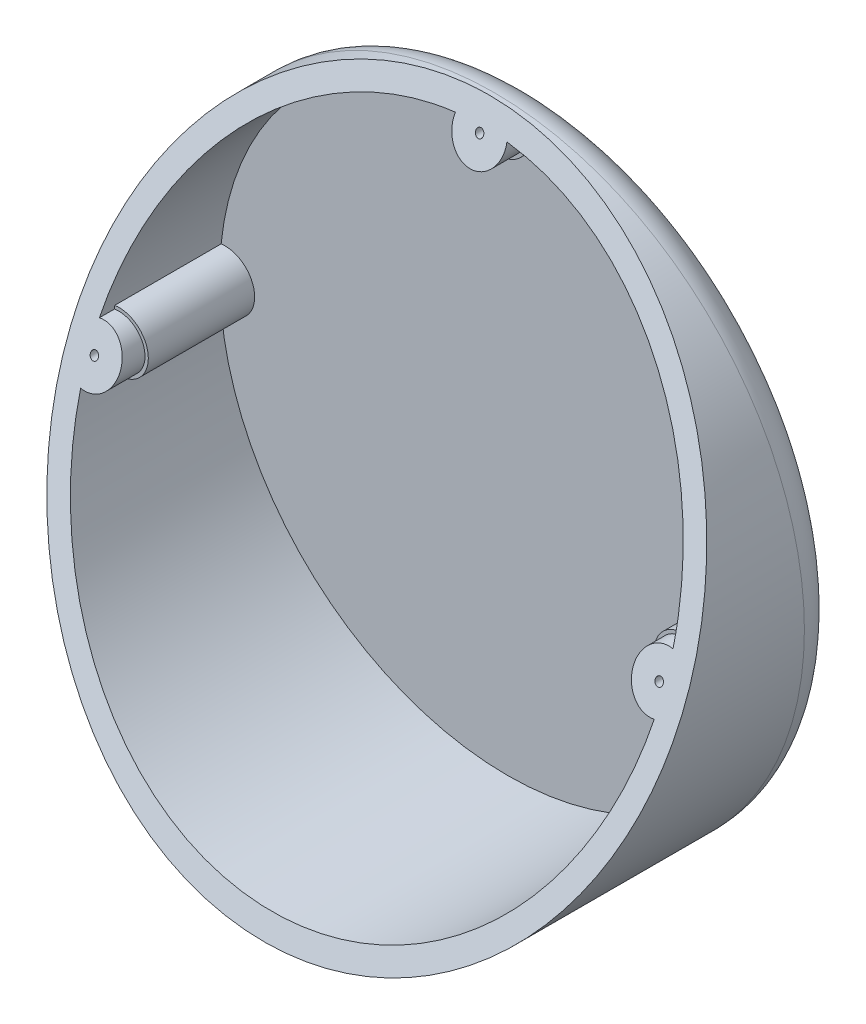
ISO-10303-21;
HEADER;
FILE_DESCRIPTION(('STEP AP214'),'2;1');
FILE_NAME('part.step','',(''),(''),'','','');
FILE_SCHEMA(('AUTOMOTIVE_DESIGN { 1 0 10303 214 1 1 1 1 }'));
ENDSEC;
DATA;
#1=APPLICATION_CONTEXT('core data for automotive mechanical design processes');
#2=APPLICATION_PROTOCOL_DEFINITION('international standard','automotive_design',2000,#1);
#3=PRODUCT_CONTEXT('',#1,'mechanical');
#4=PRODUCT('Part','Part','',(#3));
#5=PRODUCT_RELATED_PRODUCT_CATEGORY('part','',(#4));
#6=PRODUCT_DEFINITION_FORMATION('','',#4);
#7=PRODUCT_DEFINITION_CONTEXT('part definition',#1,'design');
#8=PRODUCT_DEFINITION('design','',#6,#7);
#9=PRODUCT_DEFINITION_SHAPE('','',#8);
#10=(LENGTH_UNIT() NAMED_UNIT(*) SI_UNIT(.MILLI.,.METRE.));
#11=(NAMED_UNIT(*) PLANE_ANGLE_UNIT() SI_UNIT($,.RADIAN.));
#12=(NAMED_UNIT(*) SI_UNIT($,.STERADIAN.) SOLID_ANGLE_UNIT());
#13=UNCERTAINTY_MEASURE_WITH_UNIT(LENGTH_MEASURE(1.E-05),#10,'distance_accuracy_value','');
#14=(GEOMETRIC_REPRESENTATION_CONTEXT(3) GLOBAL_UNCERTAINTY_ASSIGNED_CONTEXT((#13)) GLOBAL_UNIT_ASSIGNED_CONTEXT((#10,
#11,#12)) REPRESENTATION_CONTEXT('',''));
#15=CARTESIAN_POINT('',(0.,0.,0.));
#16=DIRECTION('',(0.,0.,1.));
#17=DIRECTION('',(1.,0.,0.));
#18=AXIS2_PLACEMENT_3D('',#15,#16,#17);
#19=CARTESIAN_POINT('',(0.,0.,60.));
#20=DIRECTION('',(0.,0.,-1.));
#21=DIRECTION('',(-1.,0.,0.));
#22=AXIS2_PLACEMENT_3D('',#19,#20,#21);
#23=CYLINDRICAL_SURFACE('',#22,70.);
#24=CARTESIAN_POINT('',(0.,0.,8.));
#25=DIRECTION('',(0.,0.,1.));
#26=DIRECTION('',(1.,0.,0.));
#27=AXIS2_PLACEMENT_3D('',#24,#25,#26);
#28=CIRCLE('',#27,70.);
#29=CARTESIAN_POINT('',(70.,0.,8.));
#30=VERTEX_POINT('',#29);
#31=EDGE_CURVE('E48',#30,#30,#28,.T.);
#32=ORIENTED_EDGE('',*,*,#31,.T.);
#33=EDGE_LOOP('',(#32));
#34=FACE_BOUND('',#33,.T.);
#35=CARTESIAN_POINT('',(0.,0.,34.5220836013663));
#36=DIRECTION('',(0.,-0.342020143325663,-0.939692620785911));
#37=DIRECTION('',(0.,0.939692620785911,-0.342020143325663));
#38=AXIS2_PLACEMENT_3D('',#35,#36,#37);
#39=ELLIPSE('',#38,74.4924440733137,70.);
#40=CARTESIAN_POINT('',(0.,70.,9.04416720273264));
#41=VERTEX_POINT('',#40);
#42=EDGE_CURVE('E248',#41,#41,#39,.T.);
#43=ORIENTED_EDGE('',*,*,#42,.T.);
#44=EDGE_LOOP('',(#43));
#45=FACE_BOUND('',#44,.T.);
#46=ADVANCED_FACE('F35',(#34,#45),#23,.T.);
#47=CARTESIAN_POINT('',(0.,0.,0.));
#48=DIRECTION('',(0.,0.,1.));
#49=DIRECTION('',(1.,0.,0.));
#50=AXIS2_PLACEMENT_3D('',#47,#48,#49);
#51=PLANE('',#50);
#52=CARTESIAN_POINT('',(0.,0.,0.));
#53=DIRECTION('',(0.,0.,1.));
#54=DIRECTION('',(1.,0.,0.));
#55=AXIS2_PLACEMENT_3D('',#52,#53,#54);
#56=CIRCLE('',#55,62.);
#57=CARTESIAN_POINT('',(62.,0.,0.));
#58=VERTEX_POINT('',#57);
#59=EDGE_CURVE('E11',#58,#58,#56,.F.);
#60=ORIENTED_EDGE('',*,*,#59,.T.);
#61=EDGE_LOOP('',(#60));
#62=FACE_BOUND('',#61,.T.);
#63=ADVANCED_FACE('F309',(#62),#51,.F.);
#64=CARTESIAN_POINT('',(-70.,70.,9.04416720273264));
#65=DIRECTION('',(0.,-0.342020143325663,-0.939692620785911));
#66=DIRECTION('',(0.,0.939692620785911,-0.342020143325663));
#67=AXIS2_PLACEMENT_3D('',#64,#65,#66);
#68=PLANE('',#67);
#69=CARTESIAN_POINT('',(0.,63.75,11.3189811668964));
#70=DIRECTION('',(0.,-0.342020143325663,-0.939692620785911));
#71=DIRECTION('',(0.,0.939692620785911,-0.342020143325663));
#72=AXIS2_PLACEMENT_3D('',#69,#70,#71);
#73=ELLIPSE('',#72,6.27864885760786,5.89999999999999);
#74=CARTESIAN_POINT('',(5.81647776002555,64.7392352941177,10.958928965152));
#75=VERTEX_POINT('',#74);
#76=CARTESIAN_POINT('',(-5.81647776002555,64.7392352941177,10.958928965152));
#77=VERTEX_POINT('',#76);
#78=EDGE_CURVE('E176',#75,#77,#73,.T.);
#79=ORIENTED_EDGE('',*,*,#78,.F.);
#80=CARTESIAN_POINT('',(0.,0.,34.5220836013663));
#81=DIRECTION('',(0.,-0.342020143325663,-0.939692620785911));
#82=DIRECTION('',(0.,0.939692620785911,-0.342020143325663));
#83=AXIS2_PLACEMENT_3D('',#80,#81,#82);
#84=ELLIPSE('',#83,69.1715552109342,65.);
#85=CARTESIAN_POINT('',(64.7392352941177,5.81647776002555,32.4050588284457));
#86=VERTEX_POINT('',#85);
#87=EDGE_CURVE('E152',#75,#86,#84,.T.);
#88=ORIENTED_EDGE('',*,*,#87,.T.);
#89=CARTESIAN_POINT('',(63.75,0.,34.5220836013663));
#90=DIRECTION('',(0.,-0.342020143325663,-0.939692620785911));
#91=DIRECTION('',(0.,0.939692620785911,-0.342020143325663));
#92=AXIS2_PLACEMENT_3D('',#89,#90,#91);
#93=ELLIPSE('',#92,6.27864885760786,5.89999999999999);
#94=CARTESIAN_POINT('',(64.7392352941177,-5.81647776002555,36.6391083742869));
#95=VERTEX_POINT('',#94);
#96=EDGE_CURVE('E166',#95,#86,#93,.T.);
#97=ORIENTED_EDGE('',*,*,#96,.F.);
#98=CARTESIAN_POINT('',(-64.7392352941177,-5.81647776002555,36.6391083742869));
#99=VERTEX_POINT('',#98);
#100=EDGE_CURVE('E56',#95,#99,#84,.T.);
#101=ORIENTED_EDGE('',*,*,#100,.T.);
#102=CARTESIAN_POINT('',(-63.75,0.,34.5220836013663));
#103=DIRECTION('',(0.,-0.342020143325663,-0.939692620785911));
#104=DIRECTION('',(0.,0.939692620785911,-0.342020143325663));
#105=AXIS2_PLACEMENT_3D('',#102,#103,#104);
#106=ELLIPSE('',#105,6.27864885760786,5.89999999999999);
#107=CARTESIAN_POINT('',(-64.7392352941177,5.81647776002555,32.4050588284457));
#108=VERTEX_POINT('',#107);
#109=EDGE_CURVE('E170',#108,#99,#106,.T.);
#110=ORIENTED_EDGE('',*,*,#109,.F.);
#111=EDGE_CURVE('E183',#108,#77,#84,.T.);
#112=ORIENTED_EDGE('',*,*,#111,.T.);
#113=EDGE_LOOP('',(#79,#88,#97,#101,#110,#112));
#114=FACE_BOUND('',#113,.T.);
#115=CARTESIAN_POINT('',(63.75,0.,34.5220836013663));
#116=DIRECTION('',(0.,-0.342020143325663,-0.939692620785911));
#117=DIRECTION('',(0.,0.939692620785911,-0.342020143325663));
#118=AXIS2_PLACEMENT_3D('',#115,#116,#117);
#119=ELLIPSE('',#118,0.957759995228309,0.899999999999991);
#120=CARTESIAN_POINT('',(63.75,0.899999999999991,34.1945103905268));
#121=VERTEX_POINT('',#120);
#122=EDGE_CURVE('E232',#121,#121,#119,.T.);
#123=ORIENTED_EDGE('',*,*,#122,.T.);
#124=EDGE_LOOP('',(#123));
#125=FACE_BOUND('',#124,.T.);
#126=CARTESIAN_POINT('',(-63.75,0.,34.5220836013663));
#127=DIRECTION('',(0.,-0.342020143325663,-0.939692620785911));
#128=DIRECTION('',(0.,0.939692620785911,-0.342020143325663));
#129=AXIS2_PLACEMENT_3D('',#126,#127,#128);
#130=ELLIPSE('',#129,0.957759995228309,0.899999999999991);
#131=CARTESIAN_POINT('',(-63.75,0.899999999999991,34.1945103905268));
#132=VERTEX_POINT('',#131);
#133=EDGE_CURVE('E240',#132,#132,#130,.T.);
#134=ORIENTED_EDGE('',*,*,#133,.T.);
#135=EDGE_LOOP('',(#134));
#136=FACE_BOUND('',#135,.T.);
#137=CARTESIAN_POINT('',(0.,63.75,11.3189811668964));
#138=DIRECTION('',(0.,-0.342020143325663,-0.939692620785911));
#139=DIRECTION('',(0.,0.939692620785911,-0.342020143325663));
#140=AXIS2_PLACEMENT_3D('',#137,#138,#139);
#141=ELLIPSE('',#140,0.95775999522831,0.899999999999992);
#142=CARTESIAN_POINT('',(0.,64.65,10.9914079560568));
#143=VERTEX_POINT('',#142);
#144=EDGE_CURVE('E247',#143,#143,#141,.T.);
#145=ORIENTED_EDGE('',*,*,#144,.T.);
#146=EDGE_LOOP('',(#145));
#147=FACE_BOUND('',#146,.T.);
#148=ORIENTED_EDGE('',*,*,#42,.F.);
#149=EDGE_LOOP('',(#148));
#150=FACE_BOUND('',#149,.T.);
#151=ADVANCED_FACE('F305',(#114,#125,#136,#147,#150),#68,.F.);
#152=CARTESIAN_POINT('',(0.,63.75,0.));
#153=DIRECTION('',(0.,0.,-1.));
#154=DIRECTION('',(-1.,0.,0.));
#155=AXIS2_PLACEMENT_3D('',#152,#153,#154);
#156=CYLINDRICAL_SURFACE('',#155,0.899999999999992);
#157=CARTESIAN_POINT('',(0.,63.75,1.8));
#158=DIRECTION('',(0.,0.,-1.));
#159=DIRECTION('',(-1.,0.,0.));
#160=AXIS2_PLACEMENT_3D('',#157,#158,#159);
#161=CIRCLE('',#160,0.9);
#162=CARTESIAN_POINT('',(-0.9,63.75,1.8));
#163=VERTEX_POINT('',#162);
#164=EDGE_CURVE('E244',#163,#163,#161,.T.);
#165=ORIENTED_EDGE('',*,*,#164,.T.);
#166=EDGE_LOOP('',(#165));
#167=FACE_BOUND('',#166,.T.);
#168=ORIENTED_EDGE('',*,*,#144,.F.);
#169=EDGE_LOOP('',(#168));
#170=FACE_BOUND('',#169,.T.);
#171=ADVANCED_FACE('F301',(#167,#170),#156,.F.);
#172=CARTESIAN_POINT('',(0.9,63.75,1.8));
#173=DIRECTION('',(0.,0.,1.));
#174=DIRECTION('',(1.,0.,0.));
#175=AXIS2_PLACEMENT_3D('',#172,#173,#174);
#176=PLANE('',#175);
#177=ORIENTED_EDGE('',*,*,#164,.F.);
#178=EDGE_LOOP('',(#177));
#179=FACE_BOUND('',#178,.T.);
#180=CARTESIAN_POINT('',(0.,63.75,1.8));
#181=DIRECTION('',(0.,0.,-1.));
#182=DIRECTION('',(-1.,0.,0.));
#183=AXIS2_PLACEMENT_3D('',#180,#181,#182);
#184=CIRCLE('',#183,1.65);
#185=CARTESIAN_POINT('',(-1.65,63.75,1.8));
#186=VERTEX_POINT('',#185);
#187=EDGE_CURVE('E241',#186,#186,#184,.T.);
#188=ORIENTED_EDGE('',*,*,#187,.T.);
#189=EDGE_LOOP('',(#188));
#190=FACE_BOUND('',#189,.T.);
#191=ADVANCED_FACE('F297',(#179,#190),#176,.F.);
#192=CARTESIAN_POINT('',(0.,63.75,0.));
#193=DIRECTION('',(0.,0.,-1.));
#194=DIRECTION('',(-1.,0.,0.));
#195=AXIS2_PLACEMENT_3D('',#192,#193,#194);
#196=CYLINDRICAL_SURFACE('',#195,1.65);
#197=ORIENTED_EDGE('',*,*,#187,.F.);
#198=EDGE_LOOP('',(#197));
#199=FACE_BOUND('',#198,.T.);
#200=CARTESIAN_POINT('',(1.64946823462954,63.7081127352517,0.189176745255946));
#201=CARTESIAN_POINT('',(1.64716596129973,63.6175369460716,0.169116172164208));
#202=CARTESIAN_POINT('',(1.63737753041773,63.5267726492758,0.150637859461782));
#203=CARTESIAN_POINT('',(1.60274681175292,63.3474524319575,0.117250854261556));
#204=CARTESIAN_POINT('',(1.57790005137276,63.2588971756998,0.10234322415751));
#205=CARTESIAN_POINT('',(1.51356731613335,63.0866204653902,0.0761612330118179));
#206=CARTESIAN_POINT('',(1.47407118651285,63.0029024110628,0.0648894024186882));
#207=CARTESIAN_POINT('',(1.38142703252199,62.8429724663497,0.0457395207333062));
#208=CARTESIAN_POINT('',(1.32827983994076,62.7667601190163,0.0378612629415091));
#209=CARTESIAN_POINT('',(1.21057127173455,62.6251041196398,0.0250589350929556));
#210=CARTESIAN_POINT('',(1.14616379665402,62.5595357426765,0.0200985380832089));
#211=CARTESIAN_POINT('',(1.00729197057499,62.4399386608513,0.0123208684116141));
#212=CARTESIAN_POINT('',(0.932827386242477,62.3859102238015,0.00950364548340374));
#213=CARTESIAN_POINT('',(0.775658448924592,62.2907803247682,0.00531224276211168));
#214=CARTESIAN_POINT('',(0.692925896679848,62.249725238595,0.00394319974907593));
#215=CARTESIAN_POINT('',(0.521769749214476,62.1819666791094,0.002042665088863));
#216=CARTESIAN_POINT('',(0.433345998768424,62.1552635974287,0.00151119629631156));
#217=CARTESIAN_POINT('',(0.252715340161557,62.1168392279502,0.00083503922353695));
#218=CARTESIAN_POINT('',(0.160488113472051,62.1052133518631,0.000692807895673315));
#219=CARTESIAN_POINT('',(-0.0246108342454278,62.0975852037299,0.000593412313948232));
#220=CARTESIAN_POINT('',(-0.117482564535827,62.1015831566863,0.00063625072532229));
#221=CARTESIAN_POINT('',(-0.301376930076902,62.1251070899242,0.000979741014404603));
#222=CARTESIAN_POINT('',(-0.392396655736193,62.1446558200126,0.00128077066010881));
#223=CARTESIAN_POINT('',(-0.569861141752124,62.1987542587002,0.00248534587152603));
#224=CARTESIAN_POINT('',(-0.656305847537114,62.2333041461907,0.00338889862249395));
#225=CARTESIAN_POINT('',(-0.822108987922822,62.3163925512165,0.00636062390383876));
#226=CARTESIAN_POINT('',(-0.901471333728862,62.3649232844833,0.00842814896618565));
#227=CARTESIAN_POINT('',(-1.05088670916843,62.4745696073834,0.0144197850229914));
#228=CARTESIAN_POINT('',(-1.12094014724031,62.5356846445667,0.0183438145268432));
#229=CARTESIAN_POINT('',(-1.24941432604106,62.6683580662472,0.028733225716578));
#230=CARTESIAN_POINT('',(-1.30788963530667,62.7398645666319,0.0351862371546038));
#231=CARTESIAN_POINT('',(-1.41198516084893,62.8913708432076,0.0512295859747638));
#232=CARTESIAN_POINT('',(-1.45760642704571,62.9713699249881,0.0608196669822341));
#233=CARTESIAN_POINT('',(-1.53455497248888,63.1368792024291,0.0834440644889267));
#234=CARTESIAN_POINT('',(-1.56597184471156,63.2223508596807,0.0964559502469035));
#235=CARTESIAN_POINT('',(-1.61427071050211,63.3967080013262,0.126035796335046));
#236=CARTESIAN_POINT('',(-1.63115225350114,63.4855935914566,0.142603866880602));
#237=CARTESIAN_POINT('',(-1.6503154768705,63.6651637710713,0.179253627970161));
#238=CARTESIAN_POINT('',(-1.65244467381088,63.7558574596646,0.199369817699489));
#239=CARTESIAN_POINT('',(-1.64199088702002,63.9357002017467,0.242452907213676));
#240=CARTESIAN_POINT('',(-1.62940515890555,64.0248489639542,0.265420338050477));
#241=CARTESIAN_POINT('',(-1.58940604412198,64.2026574200259,0.314299447106258));
#242=CARTESIAN_POINT('',(-1.56145801536247,64.2911753119463,0.340288909839039));
#243=CARTESIAN_POINT('',(-1.49132041502406,64.4620381009263,0.393354204577875));
#244=CARTESIAN_POINT('',(-1.44912675817281,64.5443812189351,0.420430346250138));
#245=CARTESIAN_POINT('',(-1.34959375238493,64.7040973040246,0.475446693065493));
#246=CARTESIAN_POINT('',(-1.29171356333333,64.7811372336628,0.503377858444082));
#247=CARTESIAN_POINT('',(-1.16303128968121,64.9243621897449,0.557355149166511));
#248=CARTESIAN_POINT('',(-1.09222759737388,64.9905458637041,0.583401039415145));
#249=CARTESIAN_POINT('',(-0.939772282192255,65.1096419860012,0.631678770574291));
#250=CARTESIAN_POINT('',(-0.85818761730344,65.16263095486,0.653932354861402));
#251=CARTESIAN_POINT('',(-0.685948030303785,65.2538129618004,0.693018181626965));
#252=CARTESIAN_POINT('',(-0.595298595203784,65.2920148832486,0.709853678011147));
#253=CARTESIAN_POINT('',(-0.414395580702783,65.3497308985496,0.735580878689558));
#254=CARTESIAN_POINT('',(-0.324574006596908,65.3703825894645,0.74495312167956));
#255=CARTESIAN_POINT('',(-0.142314441176538,65.3964224536751,0.756803234561929));
#256=CARTESIAN_POINT('',(-0.0498778951207296,65.4018188980786,0.759284840415262));
#257=CARTESIAN_POINT('',(0.127738259586101,65.397269145666,0.757204178654208));
#258=CARTESIAN_POINT('',(0.212954417330315,65.3884156319342,0.75314354483476));
#259=CARTESIAN_POINT('',(0.38053156460961,65.357778199205,0.739248344423713));
#260=CARTESIAN_POINT('',(0.462892519525226,65.3359941234819,0.729413707847977));
#261=CARTESIAN_POINT('',(0.622763805551098,65.2803098390793,0.704708405404111));
#262=CARTESIAN_POINT('',(0.700264310489702,65.2463859605323,0.689827904234969));
#263=CARTESIAN_POINT('',(0.848521036556983,65.1675913817721,0.65606549064265));
#264=CARTESIAN_POINT('',(0.919275538886677,65.1227179020449,0.637182562378971));
#265=CARTESIAN_POINT('',(1.05740698870701,65.0197734816315,0.595110010869527));
#266=CARTESIAN_POINT('',(1.12419117560922,64.9609936256059,0.571710253521818));
#267=CARTESIAN_POINT('',(1.24718584248185,64.8339074712973,0.523001891452199));
#268=CARTESIAN_POINT('',(1.30339082163832,64.7655962490074,0.497692303214266));
#269=CARTESIAN_POINT('',(1.40785275996063,64.6156800492658,0.444572678372471));
#270=CARTESIAN_POINT('',(1.4552131015191,64.5334652721266,0.416716256427111));
#271=CARTESIAN_POINT('',(1.53523570536906,64.3619615228988,0.361785995942404));
#272=CARTESIAN_POINT('',(1.56790510849215,64.2726760125608,0.334711783195855));
#273=CARTESIAN_POINT('',(1.6134065048059,64.1045375943675,0.286937782731519));
#274=CARTESIAN_POINT('',(1.62863141169014,64.0264135288501,0.265925938679276));
#275=CARTESIAN_POINT('',(1.6476801357291,63.8682795732464,0.225922118171494));
#276=CARTESIAN_POINT('',(1.65150568712938,63.7882699718837,0.206929834893264));
#277=CARTESIAN_POINT('',(1.64946823462954,63.7081127352517,0.189176745255946));
#278=B_SPLINE_CURVE_WITH_KNOTS('',3,(#200,#201,#202,#203,#204,#205,#206,#207,#208,#209,#210,
#211,#212,#213,#214,#215,#216,#217,#218,#219,#220,#221,#222,#223,#224,#225,#226,#227,#228,#229,
#230,#231,#232,#233,#234,#235,#236,#237,#238,#239,#240,#241,#242,#243,#244,#245,#246,#247,#248,
#249,#250,#251,#252,#253,#254,#255,#256,#257,#258,#259,#260,#261,#262,#263,#264,#265,#266,#267,
#268,#269,#270,#271,#272,#273,#274,#275,#276,#277),.UNSPECIFIED.,.T.,.F.,(4,2,2,2,2,2,2,2,2,2,2,
2,2,2,2,2,2,2,2,2,2,2,2,2,2,2,2,2,2,2,2,2,2,2,2,2,2,2,4),(0.,0.278116512202585,0.55631567057248,
0.834708034660553,1.11308343971521,1.38791544556012,1.66275382885175,1.93856384433904,
2.21438138563765,2.49193597540215,2.76949456231289,3.04745994834735,3.3254286492553,
3.60324288061932,3.88104491855698,4.15750474467914,4.43394198297104,4.70861042404362,
4.98328737903307,5.26079927440547,5.538362934941,5.82626135160027,6.11424240019736,
6.41380445081456,6.71340379291451,7.01122292366064,7.30886285988667,7.58529541605821,
7.86157806692169,8.11766497795304,8.37375499296483,8.63034707068835,8.88700435120138,
9.16181308875075,9.43676432476543,9.73207354034854,10.0272390592695,10.2734024494348,
10.519528387521),.UNSPECIFIED.);
#279=CARTESIAN_POINT('',(1.64946823462954,63.7081127352517,0.189176745255946));
#280=VERTEX_POINT('',#279);
#281=EDGE_CURVE('E40',#280,#280,#278,.T.);
#282=ORIENTED_EDGE('',*,*,#281,.T.);
#283=EDGE_LOOP('',(#282));
#284=FACE_BOUND('',#283,.T.);
#285=ADVANCED_FACE('F292',(#199,#284),#196,.F.);
#286=CARTESIAN_POINT('',(-63.75,0.,0.));
#287=DIRECTION('',(0.,0.,-1.));
#288=DIRECTION('',(-1.,0.,0.));
#289=AXIS2_PLACEMENT_3D('',#286,#287,#288);
#290=CYLINDRICAL_SURFACE('',#289,0.899999999999991);
#291=CARTESIAN_POINT('',(-63.75,0.,24.));
#292=DIRECTION('',(0.,0.,-1.));
#293=DIRECTION('',(-1.,0.,0.));
#294=AXIS2_PLACEMENT_3D('',#291,#292,#293);
#295=CIRCLE('',#294,0.899999999999998);
#296=CARTESIAN_POINT('',(-64.65,0.,24.));
#297=VERTEX_POINT('',#296);
#298=EDGE_CURVE('E236',#297,#297,#295,.T.);
#299=ORIENTED_EDGE('',*,*,#298,.T.);
#300=EDGE_LOOP('',(#299));
#301=FACE_BOUND('',#300,.T.);
#302=ORIENTED_EDGE('',*,*,#133,.F.);
#303=EDGE_LOOP('',(#302));
#304=FACE_BOUND('',#303,.T.);
#305=ADVANCED_FACE('F289',(#301,#304),#290,.F.);
#306=CARTESIAN_POINT('',(-62.85,0.,24.));
#307=DIRECTION('',(0.,0.,1.));
#308=DIRECTION('',(1.,0.,0.));
#309=AXIS2_PLACEMENT_3D('',#306,#307,#308);
#310=PLANE('',#309);
#311=ORIENTED_EDGE('',*,*,#298,.F.);
#312=EDGE_LOOP('',(#311));
#313=FACE_BOUND('',#312,.T.);
#314=CARTESIAN_POINT('',(-63.75,0.,24.));
#315=DIRECTION('',(0.,0.,-1.));
#316=DIRECTION('',(-1.,0.,0.));
#317=AXIS2_PLACEMENT_3D('',#314,#315,#316);
#318=CIRCLE('',#317,1.64999999999999);
#319=CARTESIAN_POINT('',(-65.4,0.,24.));
#320=VERTEX_POINT('',#319);
#321=EDGE_CURVE('E233',#320,#320,#318,.T.);
#322=ORIENTED_EDGE('',*,*,#321,.T.);
#323=EDGE_LOOP('',(#322));
#324=FACE_BOUND('',#323,.T.);
#325=ADVANCED_FACE('F285',(#313,#324),#310,.F.);
#326=CARTESIAN_POINT('',(-63.75,0.,0.));
#327=DIRECTION('',(0.,0.,-1.));
#328=DIRECTION('',(-1.,0.,0.));
#329=AXIS2_PLACEMENT_3D('',#326,#327,#328);
#330=CYLINDRICAL_SURFACE('',#329,1.65);
#331=ORIENTED_EDGE('',*,*,#321,.F.);
#332=EDGE_LOOP('',(#331));
#333=FACE_BOUND('',#332,.T.);
#334=CARTESIAN_POINT('',(-62.1,0.,0.000625024415970018));
#335=CARTESIAN_POINT('',(-62.1000032094629,-0.092643698952836,0.000623851075779382));
#336=CARTESIAN_POINT('',(-62.1078261692389,-0.185330370051784,0.000713050028932986));
#337=CARTESIAN_POINT('',(-62.138916340628,-0.368127594195056,0.0012086796301893));
#338=CARTESIAN_POINT('',(-62.16219566222,-0.458236069447161,0.00161535906655138));
#339=CARTESIAN_POINT('',(-62.2235376576828,-0.633250552957479,0.00315121137418916));
#340=CARTESIAN_POINT('',(-62.2615970587068,-0.718157708161321,0.00428022433038405));
#341=CARTESIAN_POINT('',(-62.3514016474966,-0.880348947984115,0.00786318712231402));
#342=CARTESIAN_POINT('',(-62.4031445218336,-0.957634318168672,0.0103169130652715));
#343=CARTESIAN_POINT('',(-62.5186776491833,-1.10221983406808,0.0172490895046733));
#344=CARTESIAN_POINT('',(-62.5824406870088,-1.16954193490411,0.0217229973737438));
#345=CARTESIAN_POINT('',(-62.7201845211141,-1.29247837861104,0.0333852209097131));
#346=CARTESIAN_POINT('',(-62.7941647285993,-1.34809339567157,0.0405733802011747));
#347=CARTESIAN_POINT('',(-62.9495133057976,-1.44570931727351,0.0581561760095479));
#348=CARTESIAN_POINT('',(-63.0308238836301,-1.48780651394155,0.0685270550777448));
#349=CARTESIAN_POINT('',(-63.1988167784365,-1.55787684987884,0.092801031781793));
#350=CARTESIAN_POINT('',(-63.2854989457032,-1.58585038257862,0.106704031010249));
#351=CARTESIAN_POINT('',(-63.4617957816336,-1.62715985652019,0.138075075788033));
#352=CARTESIAN_POINT('',(-63.5514148142731,-1.64047289380819,0.155548649270587));
#353=CARTESIAN_POINT('',(-63.7309304959672,-1.65234147043629,0.193737825528753));
#354=CARTESIAN_POINT('',(-63.8208271800781,-1.65089506315085,0.214453855597701));
#355=CARTESIAN_POINT('',(-64.0010254753856,-1.63337305238348,0.259142499310053));
#356=CARTESIAN_POINT('',(-64.0912689483324,-1.61689213024705,0.283189598880067));
#357=CARTESIAN_POINT('',(-64.2673220959964,-1.56945710072082,0.333169067108692));
#358=CARTESIAN_POINT('',(-64.3531306248704,-1.53849927353076,0.359101918858933));
#359=CARTESIAN_POINT('',(-64.5219655264909,-1.46135515634642,0.412902156259354));
#360=CARTESIAN_POINT('',(-64.6047013511874,-1.41455632372484,0.440804386998846));
#361=CARTESIAN_POINT('',(-64.7610981772551,-1.30735332234228,0.495991778004494));
#362=CARTESIAN_POINT('',(-64.8347568328016,-1.24694564798994,0.523276777277545));
#363=CARTESIAN_POINT('',(-64.9721757517149,-1.11272903968891,0.576051823212608));
#364=CARTESIAN_POINT('',(-65.0357447401824,-1.03870817562729,0.601503093655006));
#365=CARTESIAN_POINT('',(-65.1493239531966,-0.879730282523726,0.648246754552388));
#366=CARTESIAN_POINT('',(-65.1993385377794,-0.794776783174568,0.669540481743898));
#367=CARTESIAN_POINT('',(-65.2816955549597,-0.620659440382631,0.705254099885658));
#368=CARTESIAN_POINT('',(-65.3147899380272,-0.531911895672553,0.71996196856372));
#369=CARTESIAN_POINT('',(-65.3653851882667,-0.349272641186529,0.742653154007391));
#370=CARTESIAN_POINT('',(-65.3828971453623,-0.255384640441945,0.75064125297321));
#371=CARTESIAN_POINT('',(-65.4006703935162,-0.0736236976295547,0.758754845384123));
#372=CARTESIAN_POINT('',(-65.4022523401615,0.014095321572717,0.759482229854129));
#373=CARTESIAN_POINT('',(-65.3915235874724,0.188488339626496,0.754577107284764));
#374=CARTESIAN_POINT('',(-65.3792151358374,0.27516250525934,0.748945629215884));
#375=CARTESIAN_POINT('',(-65.3418555076124,0.442270958120942,0.732075653091026));
#376=CARTESIAN_POINT('',(-65.3172107943123,0.522815362650291,0.721016212686436));
#377=CARTESIAN_POINT('',(-65.2563391819298,0.678554915435853,0.694205722978661));
#378=CARTESIAN_POINT('',(-65.2201100699012,0.753749038279714,0.678453777314199));
#379=CARTESIAN_POINT('',(-65.1351191612585,0.900845729197236,0.642394652604396));
#380=CARTESIAN_POINT('',(-65.0858138683584,0.972386629383774,0.621896607583269));
#381=CARTESIAN_POINT('',(-64.9771295127609,1.10639215397026,0.578136699106842));
#382=CARTESIAN_POINT('',(-64.9177466821609,1.16885336727837,0.554873802876441));
#383=CARTESIAN_POINT('',(-64.7851655657224,1.28822328258956,0.504883484745199));
#384=CARTESIAN_POINT('',(-64.7112367974792,1.34426851601681,0.478028141304098));
#385=CARTESIAN_POINT('',(-64.555124111281,1.44319792192037,0.424024149846507));
#386=CARTESIAN_POINT('',(-64.4729377627586,1.48607820422376,0.396875417583738));
#387=CARTESIAN_POINT('',(-64.2985471375919,1.55913800979868,0.342453429163668));
#388=CARTESIAN_POINT('',(-64.2060631808677,1.58868722746522,0.315225677522081));
#389=CARTESIAN_POINT('',(-64.0166947236092,1.63119180951457,0.263188837038907));
#390=CARTESIAN_POINT('',(-63.9198106801038,1.64414889322895,0.238379497839641));
#391=CARTESIAN_POINT('',(-63.7263507939029,1.65261323089869,0.192635568019692));
#392=CARTESIAN_POINT('',(-63.6298054811815,1.64845435981362,0.171635105896064));
#393=CARTESIAN_POINT('',(-63.438181136528,1.62314531653397,0.133547250690377));
#394=CARTESIAN_POINT('',(-63.3431016903054,1.60200003829464,0.116458732359763));
#395=CARTESIAN_POINT('',(-63.1617155359391,1.54436767998062,0.0870735385121131));
#396=CARTESIAN_POINT('',(-63.0752066884157,1.50860711274053,0.0745970993201759));
#397=CARTESIAN_POINT('',(-62.9091480098306,1.4227439956286,0.0532307661378058));
#398=CARTESIAN_POINT('',(-62.8295970932999,1.37264368805112,0.0443403119328503));
#399=CARTESIAN_POINT('',(-62.6817890230638,1.26087482679141,0.0298490137964825));
#400=CARTESIAN_POINT('',(-62.6133058382163,1.19951427050992,0.0241740326621299));
#401=CARTESIAN_POINT('',(-62.487393436872,1.06617680094273,0.0151593748704465));
#402=CARTESIAN_POINT('',(-62.4299659722186,0.994198208353419,0.0118200680939957));
#403=CARTESIAN_POINT('',(-62.3277538353989,0.841530362817298,0.00677785722703146));
#404=CARTESIAN_POINT('',(-62.2829925366456,0.760825380979656,0.00507796468072587));
#405=CARTESIAN_POINT('',(-62.2075505351492,0.593120338179386,0.00267109612162146));
#406=CARTESIAN_POINT('',(-62.1768594793539,0.506124960510918,0.00196338925507511));
#407=CARTESIAN_POINT('',(-62.1358389475721,0.349193346752679,0.00114915206565349));
#408=CARTESIAN_POINT('',(-62.122420710391,0.28004733829846,0.000940486982556564));
#409=CARTESIAN_POINT('',(-62.1044999865761,0.140609143952816,0.000678867883326282));
#410=CARTESIAN_POINT('',(-62.0999975640044,0.0703169498294605,0.000625914986016879));
#411=CARTESIAN_POINT('',(-62.1,0.,0.000625024415970018));
#412=B_SPLINE_CURVE_WITH_KNOTS('',3,(#334,#335,#336,#337,#338,#339,#340,#341,#342,#343,#344,
#345,#346,#347,#348,#349,#350,#351,#352,#353,#354,#355,#356,#357,#358,#359,#360,#361,#362,#363,
#364,#365,#366,#367,#368,#369,#370,#371,#372,#373,#374,#375,#376,#377,#378,#379,#380,#381,#382,
#383,#384,#385,#386,#387,#388,#389,#390,#391,#392,#393,#394,#395,#396,#397,#398,#399,#400,#401,
#402,#403,#404,#405,#406,#407,#408,#409,#410,#411),.UNSPECIFIED.,.T.,.F.,(4,2,2,2,2,2,2,2,2,2,2,
2,2,2,2,2,2,2,2,2,2,2,2,2,2,2,2,2,2,2,2,2,2,2,2,2,2,2,4),(0.,0.277678126570116,
0.555574069642771,0.833408511510299,1.11119601063574,1.38836195725214,1.66551193801718,
1.94064147688442,2.21576335128628,2.49131443888216,2.76690186942542,3.05014579725766,
3.33346254384798,3.6293001901184,3.92521413047527,4.22619948904653,4.52708791463391,
4.81308881568319,5.09888600834938,5.36077278966359,5.6226171993813,5.87635198607133,
6.13013527223489,6.39682021782703,6.66360509514503,6.95206599617988,7.24061205401635,
7.54165157475186,7.84265989825581,8.13782466759788,8.43290442747871,8.71482008238896,
8.99669167842249,9.27176807442516,9.54688802208008,9.82251239783048,10.0979336390863,
10.3086909687509,10.5194498127464),.UNSPECIFIED.);
#413=CARTESIAN_POINT('',(-62.1,0.,0.000625024415970018));
#414=VERTEX_POINT('',#413);
#415=EDGE_CURVE('E237',#414,#414,#412,.T.);
#416=ORIENTED_EDGE('',*,*,#415,.T.);
#417=EDGE_LOOP('',(#416));
#418=FACE_BOUND('',#417,.T.);
#419=ADVANCED_FACE('F280',(#333,#418),#330,.F.);
#420=CARTESIAN_POINT('',(63.75,0.,0.));
#421=DIRECTION('',(0.,0.,-1.));
#422=DIRECTION('',(-1.,0.,0.));
#423=AXIS2_PLACEMENT_3D('',#420,#421,#422);
#424=CYLINDRICAL_SURFACE('',#423,0.899999999999991);
#425=CARTESIAN_POINT('',(63.75,0.,24.));
#426=DIRECTION('',(0.,0.,-1.));
#427=DIRECTION('',(-1.,0.,0.));
#428=AXIS2_PLACEMENT_3D('',#425,#426,#427);
#429=CIRCLE('',#428,0.899999999999998);
#430=CARTESIAN_POINT('',(62.85,0.,24.));
#431=VERTEX_POINT('',#430);
#432=EDGE_CURVE('E228',#431,#431,#429,.T.);
#433=ORIENTED_EDGE('',*,*,#432,.T.);
#434=EDGE_LOOP('',(#433));
#435=FACE_BOUND('',#434,.T.);
#436=ORIENTED_EDGE('',*,*,#122,.F.);
#437=EDGE_LOOP('',(#436));
#438=FACE_BOUND('',#437,.T.);
#439=ADVANCED_FACE('F277',(#435,#438),#424,.F.);
#440=CARTESIAN_POINT('',(64.65,0.,24.));
#441=DIRECTION('',(0.,0.,1.));
#442=DIRECTION('',(1.,0.,0.));
#443=AXIS2_PLACEMENT_3D('',#440,#441,#442);
#444=PLANE('',#443);
#445=ORIENTED_EDGE('',*,*,#432,.F.);
#446=EDGE_LOOP('',(#445));
#447=FACE_BOUND('',#446,.T.);
#448=CARTESIAN_POINT('',(63.75,0.,24.));
#449=DIRECTION('',(0.,0.,-1.));
#450=DIRECTION('',(-1.,0.,0.));
#451=AXIS2_PLACEMENT_3D('',#448,#449,#450);
#452=CIRCLE('',#451,1.65);
#453=CARTESIAN_POINT('',(62.1,0.,24.));
#454=VERTEX_POINT('',#453);
#455=EDGE_CURVE('E225',#454,#454,#452,.T.);
#456=ORIENTED_EDGE('',*,*,#455,.T.);
#457=EDGE_LOOP('',(#456));
#458=FACE_BOUND('',#457,.T.);
#459=ADVANCED_FACE('F272',(#447,#458),#444,.F.);
#460=CARTESIAN_POINT('',(63.75,0.,0.));
#461=DIRECTION('',(0.,0.,-1.));
#462=DIRECTION('',(-1.,0.,0.));
#463=AXIS2_PLACEMENT_3D('',#460,#461,#462);
#464=CYLINDRICAL_SURFACE('',#463,1.65);
#465=ORIENTED_EDGE('',*,*,#455,.F.);
#466=EDGE_LOOP('',(#465));
#467=FACE_BOUND('',#466,.T.);
#468=CARTESIAN_POINT('',(65.4,0.,0.758453203907319));
#469=CARTESIAN_POINT('',(65.3999962183871,-0.0873287267224163,0.758450371255087));
#470=CARTESIAN_POINT('',(65.3930346159144,-0.174699623055175,0.755253933211841));
#471=CARTESIAN_POINT('',(65.3654901428946,-0.346852309753121,0.742736471155483));
#472=CARTESIAN_POINT('',(65.3448953441973,-0.431631764760948,0.733410083890695));
#473=CARTESIAN_POINT('',(65.2910305161531,-0.595971782813097,0.709432489024419));
#474=CARTESIAN_POINT('',(65.2577960772632,-0.675546271214577,0.694796238120742));
#475=CARTESIAN_POINT('',(65.1798547652311,-0.827852388051412,0.661262029726747));
#476=CARTESIAN_POINT('',(65.1351468301338,-0.900583382219831,0.642363677767793));
#477=CARTESIAN_POINT('',(65.0332213029442,-1.04102104682197,0.600522854952021));
#478=CARTESIAN_POINT('',(64.9755095159206,-1.10832372111427,0.577430694268604));
#479=CARTESIAN_POINT('',(64.8505196749496,-1.23252830481928,0.529246694426108));
#480=CARTESIAN_POINT('',(64.7832383220756,-1.28942661199868,0.504154166995053));
#481=CARTESIAN_POINT('',(64.6352463142679,-1.39561725078834,0.451329654577411));
#482=CARTESIAN_POINT('',(64.5539038516635,-1.44400390827524,0.423541931294336));
#483=CARTESIAN_POINT('',(64.383966379174,-1.52627035520516,0.368616665026127));
#484=CARTESIAN_POINT('',(64.2953699263569,-1.56014725003783,0.341479252792567));
#485=CARTESIAN_POINT('',(64.1111821336657,-1.6128902995449,0.288572550752551));
#486=CARTESIAN_POINT('',(64.0154816224331,-1.63141943036665,0.262845009612506));
#487=CARTESIAN_POINT('',(63.8215339050786,-1.65132645342808,0.214521966801308));
#488=CARTESIAN_POINT('',(63.7232872788098,-1.65270821701004,0.191925759311595));
#489=CARTESIAN_POINT('',(63.5306371607268,-1.63810597188123,0.151340524476068));
#490=CARTESIAN_POINT('',(63.436216757945,-1.62271191048553,0.133220777262663));
#491=CARTESIAN_POINT('',(63.2508381066616,-1.57558767060777,0.100956062525864));
#492=CARTESIAN_POINT('',(63.1598789947251,-1.54386159529292,0.0868100980298181));
#493=CARTESIAN_POINT('',(62.988067697175,-1.4664485611221,0.0629290332382311));
#494=CARTESIAN_POINT('',(62.9069535608804,-1.42139028203647,0.0530362880984418));
#495=CARTESIAN_POINT('',(62.7532062168389,-1.31813302628637,0.036469138439599));
#496=CARTESIAN_POINT('',(62.6805723667388,-1.25993504589136,0.0297944900404541));
#497=CARTESIAN_POINT('',(62.5469560261725,-1.13294489050959,0.0191387766565824));
#498=CARTESIAN_POINT('',(62.4858257857042,-1.06431100337816,0.0151216048130961));
#499=CARTESIAN_POINT('',(62.3757611892279,-0.917803198468759,0.00894924418735296));
#500=CARTESIAN_POINT('',(62.3268271155005,-0.839929066886648,0.00679409849889289));
#501=CARTESIAN_POINT('',(62.2423142840636,-0.67666848315909,0.00366292297160383));
#502=CARTESIAN_POINT('',(62.2068116836063,-0.59124248396669,0.00269354930595042));
#503=CARTESIAN_POINT('',(62.1505545303543,-0.415660136384907,0.00138949295330059));
#504=CARTESIAN_POINT('',(62.1298003404598,-0.325503671656044,0.00105482588359103));
#505=CARTESIAN_POINT('',(62.1035544948157,-0.142502317050913,0.000659848007722957));
#506=CARTESIAN_POINT('',(62.0981448690324,-0.0496456489597009,0.000601010662362304));
#507=CARTESIAN_POINT('',(62.1029763104295,0.135660341970897,0.000663467341999952));
#508=CARTESIAN_POINT('',(62.1132176090437,0.228109658766412,0.0007847640306807));
#509=CARTESIAN_POINT('',(62.1490766426235,0.410060767995736,0.00139227825544272));
#510=CARTESIAN_POINT('',(62.1747079201806,0.499559891115193,0.00187881728525484));
#511=CARTESIAN_POINT('',(62.2406284668474,0.672980255235647,0.00365727796247597));
#512=CARTESIAN_POINT('',(62.2809178231619,0.756901463048655,0.00494920440137789));
#513=CARTESIAN_POINT('',(62.374944668946,0.916682071401188,0.00896364583296517));
#514=CARTESIAN_POINT('',(62.4286677622628,0.992549979001414,0.0116846327975888));
#515=CARTESIAN_POINT('',(62.5480078819767,1.13414562586817,0.0192692293705796));
#516=CARTESIAN_POINT('',(62.6136242122043,1.19987395823723,0.0241327135918769));
#517=CARTESIAN_POINT('',(62.7543607894183,1.31895758559714,0.0366466526963175));
#518=CARTESIAN_POINT('',(62.8294226312911,1.37238364755064,0.0442804818991806));
#519=CARTESIAN_POINT('',(62.9870653598622,1.46588824150887,0.0628577457599575));
#520=CARTESIAN_POINT('',(63.0696457010757,1.5059677408571,0.0738009404491196));
#521=CARTESIAN_POINT('',(63.2393997883094,1.57163319721047,0.0992037854402085));
#522=CARTESIAN_POINT('',(63.3265496554118,1.59728761094182,0.113646353093938));
#523=CARTESIAN_POINT('',(63.5032393055882,1.63393772379267,0.146033252278367));
#524=CARTESIAN_POINT('',(63.5927792487871,1.64493243824749,0.163977818939024));
#525=CARTESIAN_POINT('',(63.7731723010059,1.65234417148401,0.203323125616044));
#526=CARTESIAN_POINT('',(63.8640238600516,1.64852865807888,0.224773888909003));
#527=CARTESIAN_POINT('',(64.0432434856414,1.62624359531255,0.270260404084935));
#528=CARTESIAN_POINT('',(64.1316110314229,1.60777099653418,0.294296692988728));
#529=CARTESIAN_POINT('',(64.3072667887605,1.55585381225999,0.345071320957694));
#530=CARTESIAN_POINT('',(64.3943625821678,1.52182704295847,0.371880005607891));
#531=CARTESIAN_POINT('',(64.5614552332616,1.43969190700506,0.426090490311396));
#532=CARTESIAN_POINT('',(64.6414501171848,1.39157964103306,0.453492452655294));
#533=CARTESIAN_POINT('',(64.7950404071798,1.28050100489161,0.508423866665636));
#534=CARTESIAN_POINT('',(64.8683139484514,1.2170737845393,0.535924229566769));
#535=CARTESIAN_POINT('',(65.0031010680499,1.0777880454325,0.588323599703904));
#536=CARTESIAN_POINT('',(65.064612571164,1.00192733737595,0.613222147542827));
#537=CARTESIAN_POINT('',(65.1727127101017,0.841182495934077,0.658134983064243));
#538=CARTESIAN_POINT('',(65.2195681442446,0.756502393049808,0.678234793704971));
#539=CARTESIAN_POINT('',(65.2979892469529,0.579292311357699,0.712442922999714));
#540=CARTESIAN_POINT('',(65.3295804914695,0.486775770840885,0.726561259004183));
#541=CARTESIAN_POINT('',(65.3684020072263,0.328035618681688,0.744050395113538));
#542=CARTESIAN_POINT('',(65.3802215610127,0.263118656893424,0.749426497181737));
#543=CARTESIAN_POINT('',(65.3960215133045,0.132142419580677,0.756628758280267));
#544=CARTESIAN_POINT('',(65.4000028616173,0.0660832834398088,0.758455347428327));
#545=CARTESIAN_POINT('',(65.4,0.,0.758453203907319));
#546=B_SPLINE_CURVE_WITH_KNOTS('',3,(#468,#469,#470,#471,#472,#473,#474,#475,#476,#477,#478,
#479,#480,#481,#482,#483,#484,#485,#486,#487,#488,#489,#490,#491,#492,#493,#494,#495,#496,#497,
#498,#499,#500,#501,#502,#503,#504,#505,#506,#507,#508,#509,#510,#511,#512,#513,#514,#515,#516,
#517,#518,#519,#520,#521,#522,#523,#524,#525,#526,#527,#528,#529,#530,#531,#532,#533,#534,#535,
#536,#537,#538,#539,#540,#541,#542,#543,#544,#545),.UNSPECIFIED.,.T.,.F.,(4,2,2,2,2,2,2,2,2,2,2,
2,2,2,2,2,2,2,2,2,2,2,2,2,2,2,2,2,2,2,2,2,2,2,2,2,2,2,4),(0.,0.261732019728948,
0.523693340970028,0.784922433206694,1.04617571281053,1.31986568391382,1.59365023415976,
1.88822514775501,2.18285879993249,2.48380261941554,2.7846784939064,3.07530528060048,
3.36585908739475,3.64444841875831,3.92301663420129,4.19771767629785,4.47242507576686,
4.74866753511104,5.02491679145684,5.30264008086967,5.5803674770801,5.85833962164989,
6.13631341997568,6.4139905971358,6.69165152573222,6.96767296088485,7.24367438596488,
7.51835469833075,7.79305345953208,8.07208251982488,8.35116964754164,8.64168658954251,
8.93228403218098,9.23304970522008,9.53386839441426,9.82884051705356,10.1233166695763,
10.321398196264,10.5194557186186),.UNSPECIFIED.);
#547=CARTESIAN_POINT('',(65.4,0.,0.758453203907319));
#548=VERTEX_POINT('',#547);
#549=EDGE_CURVE('E229',#548,#548,#546,.T.);
#550=ORIENTED_EDGE('',*,*,#549,.T.);
#551=EDGE_LOOP('',(#550));
#552=FACE_BOUND('',#551,.T.);
#553=ADVANCED_FACE('F266',(#467,#552),#464,.F.);
#554=CARTESIAN_POINT('',(0.,0.,60.));
#555=DIRECTION('',(0.,0.,-1.));
#556=DIRECTION('',(-1.,0.,0.));
#557=AXIS2_PLACEMENT_3D('',#554,#555,#556);
#558=CYLINDRICAL_SURFACE('',#557,65.);
#559=CARTESIAN_POINT('',(0.,0.,29.));
#560=DIRECTION('',(0.,0.,1.));
#561=DIRECTION('',(1.,0.,0.));
#562=AXIS2_PLACEMENT_3D('',#559,#560,#561);
#563=CIRCLE('',#562,65.);
#564=CARTESIAN_POINT('',(64.7392352941177,-5.81647776002555,29.));
#565=VERTEX_POINT('',#564);
#566=CARTESIAN_POINT('',(64.6654117647059,-6.58669274378557,29.));
#567=VERTEX_POINT('',#566);
#568=EDGE_CURVE('E224',#565,#567,#563,.F.);
#569=ORIENTED_EDGE('',*,*,#568,.T.);
#570=DIRECTION('',(0.,0.,-1.));
#571=VECTOR('',#570,1.);
#572=CARTESIAN_POINT('',(64.6654117647059,-6.58669274378557,0.));
#573=LINE('',#572,#571);
#574=CARTESIAN_POINT('',(64.6654117647059,-6.58669274378561,5.));
#575=VERTEX_POINT('',#574);
#576=EDGE_CURVE('E141',#575,#567,#573,.F.);
#577=ORIENTED_EDGE('',*,*,#576,.F.);
#578=CARTESIAN_POINT('',(0.,0.,5.));
#579=DIRECTION('',(0.,0.,1.));
#580=DIRECTION('',(1.,0.,0.));
#581=AXIS2_PLACEMENT_3D('',#578,#579,#580);
#582=CIRCLE('',#581,65.);
#583=CARTESIAN_POINT('',(-64.6654117647059,-6.58669274378561,5.));
#584=VERTEX_POINT('',#583);
#585=EDGE_CURVE('E154',#584,#575,#582,.T.);
#586=ORIENTED_EDGE('',*,*,#585,.F.);
#587=DIRECTION('',(0.,0.,-1.));
#588=VECTOR('',#587,1.);
#589=CARTESIAN_POINT('',(-64.6654117647059,-6.58669274378561,60.));
#590=LINE('',#589,#588);
#591=CARTESIAN_POINT('',(-64.6654117647059,-6.58669274378561,29.));
#592=VERTEX_POINT('',#591);
#593=EDGE_CURVE('E214',#584,#592,#590,.F.);
#594=ORIENTED_EDGE('',*,*,#593,.T.);
#595=CARTESIAN_POINT('',(0.,0.,29.));
#596=DIRECTION('',(0.,0.,1.));
#597=DIRECTION('',(1.,0.,0.));
#598=AXIS2_PLACEMENT_3D('',#595,#596,#597);
#599=CIRCLE('',#598,65.);
#600=CARTESIAN_POINT('',(-64.7392352941177,-5.81647776002555,29.));
#601=VERTEX_POINT('',#600);
#602=EDGE_CURVE('E222',#592,#601,#599,.F.);
#603=ORIENTED_EDGE('',*,*,#602,.T.);
#604=DIRECTION('',(0.,0.,1.));
#605=VECTOR('',#604,1.);
#606=CARTESIAN_POINT('',(-64.7392352941177,-5.81647776002555,0.));
#607=LINE('',#606,#605);
#608=EDGE_CURVE('E199',#99,#601,#607,.F.);
#609=ORIENTED_EDGE('',*,*,#608,.F.);
#610=ORIENTED_EDGE('',*,*,#100,.F.);
#611=DIRECTION('',(0.,0.,1.));
#612=VECTOR('',#611,1.);
#613=CARTESIAN_POINT('',(64.7392352941177,-5.81647776002555,60.));
#614=LINE('',#613,#612);
#615=EDGE_CURVE('E205',#95,#565,#614,.F.);
#616=ORIENTED_EDGE('',*,*,#615,.T.);
#617=EDGE_LOOP('',(#569,#577,#586,#594,#603,#609,#610,#616));
#618=FACE_BOUND('',#617,.T.);
#619=ADVANCED_FACE('F271',(#618),#558,.F.);
#620=CARTESIAN_POINT('',(64.6654117647059,6.58669274378561,29.));
#621=VERTEX_POINT('',#620);
#622=CARTESIAN_POINT('',(64.7392352941177,5.81647776002555,29.));
#623=VERTEX_POINT('',#622);
#624=EDGE_CURVE('E64',#621,#623,#563,.F.);
#625=ORIENTED_EDGE('',*,*,#624,.T.);
#626=DIRECTION('',(0.,0.,1.));
#627=VECTOR('',#626,1.);
#628=CARTESIAN_POINT('',(64.7392352941177,5.81647776002555,0.));
#629=LINE('',#628,#627);
#630=EDGE_CURVE('E202',#86,#623,#629,.F.);
#631=ORIENTED_EDGE('',*,*,#630,.F.);
#632=ORIENTED_EDGE('',*,*,#87,.F.);
#633=DIRECTION('',(0.,0.,1.));
#634=VECTOR('',#633,1.);
#635=CARTESIAN_POINT('',(5.81647776002555,64.7392352941177,60.));
#636=LINE('',#635,#634);
#637=CARTESIAN_POINT('',(5.81647776002555,64.7392352941177,6.8));
#638=VERTEX_POINT('',#637);
#639=EDGE_CURVE('E192',#75,#638,#636,.F.);
#640=ORIENTED_EDGE('',*,*,#639,.T.);
#641=CARTESIAN_POINT('',(0.,0.,6.8));
#642=DIRECTION('',(0.,0.,1.));
#643=DIRECTION('',(1.,0.,0.));
#644=AXIS2_PLACEMENT_3D('',#641,#642,#643);
#645=CIRCLE('',#644,65.);
#646=CARTESIAN_POINT('',(6.58669274378557,64.6654117647059,6.8));
#647=VERTEX_POINT('',#646);
#648=EDGE_CURVE('E219',#647,#638,#645,.T.);
#649=ORIENTED_EDGE('',*,*,#648,.F.);
#650=DIRECTION('',(0.,0.,-1.));
#651=VECTOR('',#650,1.);
#652=CARTESIAN_POINT('',(6.58669274378557,64.6654117647059,0.));
#653=LINE('',#652,#651);
#654=CARTESIAN_POINT('',(6.58669274378561,64.6654117647059,5.));
#655=VERTEX_POINT('',#654);
#656=EDGE_CURVE('E147',#655,#647,#653,.F.);
#657=ORIENTED_EDGE('',*,*,#656,.F.);
#658=CARTESIAN_POINT('',(64.6654117647059,6.58669274378561,5.));
#659=VERTEX_POINT('',#658);
#660=EDGE_CURVE('E144',#659,#655,#582,.T.);
#661=ORIENTED_EDGE('',*,*,#660,.F.);
#662=DIRECTION('',(0.,0.,-1.));
#663=VECTOR('',#662,1.);
#664=CARTESIAN_POINT('',(64.6654117647059,6.58669274378561,60.));
#665=LINE('',#664,#663);
#666=EDGE_CURVE('E132',#659,#621,#665,.F.);
#667=ORIENTED_EDGE('',*,*,#666,.T.);
#668=EDGE_LOOP('',(#625,#631,#632,#640,#649,#657,#661,#667));
#669=FACE_BOUND('',#668,.T.);
#670=ADVANCED_FACE('F145',(#669),#558,.F.);
#671=CARTESIAN_POINT('',(64.65,0.,29.));
#672=DIRECTION('',(0.,0.,1.));
#673=DIRECTION('',(1.,0.,0.));
#674=AXIS2_PLACEMENT_3D('',#671,#672,#673);
#675=PLANE('',#674);
#676=CARTESIAN_POINT('',(63.75,0.,29.));
#677=DIRECTION('',(0.,0.,1.));
#678=DIRECTION('',(1.,0.,0.));
#679=AXIS2_PLACEMENT_3D('',#676,#677,#678);
#680=CIRCLE('',#679,5.89999999999999);
#681=EDGE_CURVE('E160',#565,#623,#680,.F.);
#682=ORIENTED_EDGE('',*,*,#681,.T.);
#683=ORIENTED_EDGE('',*,*,#624,.F.);
#684=CARTESIAN_POINT('',(63.75,0.,29.));
#685=DIRECTION('',(0.,0.,1.));
#686=DIRECTION('',(1.,0.,0.));
#687=AXIS2_PLACEMENT_3D('',#684,#685,#686);
#688=CIRCLE('',#687,6.65);
#689=EDGE_CURVE('E138',#567,#621,#688,.F.);
#690=ORIENTED_EDGE('',*,*,#689,.F.);
#691=ORIENTED_EDGE('',*,*,#568,.F.);
#692=EDGE_LOOP('',(#682,#683,#690,#691));
#693=FACE_BOUND('',#692,.T.);
#694=ADVANCED_FACE('F353',(#693),#675,.T.);
#695=CARTESIAN_POINT('',(-64.7392352941177,5.81647776002555,29.));
#696=VERTEX_POINT('',#695);
#697=CARTESIAN_POINT('',(-64.6654117647059,6.58669274378571,29.));
#698=VERTEX_POINT('',#697);
#699=EDGE_CURVE('E220',#696,#698,#599,.F.);
#700=ORIENTED_EDGE('',*,*,#699,.T.);
#701=DIRECTION('',(0.,0.,-1.));
#702=VECTOR('',#701,1.);
#703=CARTESIAN_POINT('',(-64.6654117647059,6.58669274378571,0.));
#704=LINE('',#703,#702);
#705=CARTESIAN_POINT('',(-64.6654117647059,6.58669274378561,5.));
#706=VERTEX_POINT('',#705);
#707=EDGE_CURVE('E211',#706,#698,#704,.F.);
#708=ORIENTED_EDGE('',*,*,#707,.F.);
#709=CARTESIAN_POINT('',(-6.58669274378561,64.6654117647059,5.));
#710=VERTEX_POINT('',#709);
#711=EDGE_CURVE('E151',#710,#706,#582,.T.);
#712=ORIENTED_EDGE('',*,*,#711,.F.);
#713=DIRECTION('',(0.,0.,-1.));
#714=VECTOR('',#713,1.);
#715=CARTESIAN_POINT('',(-6.58669274378561,64.6654117647059,60.));
#716=LINE('',#715,#714);
#717=CARTESIAN_POINT('',(-6.58669274378561,64.6654117647059,6.8));
#718=VERTEX_POINT('',#717);
#719=EDGE_CURVE('E208',#710,#718,#716,.F.);
#720=ORIENTED_EDGE('',*,*,#719,.T.);
#721=CARTESIAN_POINT('',(-5.81647776002555,64.7392352941177,6.8));
#722=VERTEX_POINT('',#721);
#723=EDGE_CURVE('E140',#722,#718,#645,.T.);
#724=ORIENTED_EDGE('',*,*,#723,.F.);
#725=DIRECTION('',(0.,0.,1.));
#726=VECTOR('',#725,1.);
#727=CARTESIAN_POINT('',(-5.81647776002555,64.7392352941177,0.));
#728=LINE('',#727,#726);
#729=EDGE_CURVE('E194',#77,#722,#728,.F.);
#730=ORIENTED_EDGE('',*,*,#729,.F.);
#731=ORIENTED_EDGE('',*,*,#111,.F.);
#732=DIRECTION('',(0.,0.,1.));
#733=VECTOR('',#732,1.);
#734=CARTESIAN_POINT('',(-64.7392352941177,5.81647776002555,60.));
#735=LINE('',#734,#733);
#736=EDGE_CURVE('E196',#108,#696,#735,.F.);
#737=ORIENTED_EDGE('',*,*,#736,.T.);
#738=EDGE_LOOP('',(#700,#708,#712,#720,#724,#730,#731,#737));
#739=FACE_BOUND('',#738,.T.);
#740=ADVANCED_FACE('F355',(#739),#558,.F.);
#741=CARTESIAN_POINT('',(-62.85,0.,29.));
#742=DIRECTION('',(0.,0.,1.));
#743=DIRECTION('',(1.,0.,0.));
#744=AXIS2_PLACEMENT_3D('',#741,#742,#743);
#745=PLANE('',#744);
#746=CARTESIAN_POINT('',(-63.75,0.,29.));
#747=DIRECTION('',(0.,0.,1.));
#748=DIRECTION('',(1.,0.,0.));
#749=AXIS2_PLACEMENT_3D('',#746,#747,#748);
#750=CIRCLE('',#749,6.65);
#751=EDGE_CURVE('E165',#698,#592,#750,.F.);
#752=ORIENTED_EDGE('',*,*,#751,.F.);
#753=ORIENTED_EDGE('',*,*,#699,.F.);
#754=CARTESIAN_POINT('',(-63.75,0.,29.));
#755=DIRECTION('',(0.,0.,1.));
#756=DIRECTION('',(1.,0.,0.));
#757=AXIS2_PLACEMENT_3D('',#754,#755,#756);
#758=CIRCLE('',#757,5.89999999999999);
#759=EDGE_CURVE('E179',#696,#601,#758,.F.);
#760=ORIENTED_EDGE('',*,*,#759,.T.);
#761=ORIENTED_EDGE('',*,*,#602,.F.);
#762=EDGE_LOOP('',(#752,#753,#760,#761));
#763=FACE_BOUND('',#762,.T.);
#764=ADVANCED_FACE('F360',(#763),#745,.T.);
#765=CARTESIAN_POINT('',(0.,0.,5.));
#766=DIRECTION('',(0.,0.,1.));
#767=DIRECTION('',(1.,0.,0.));
#768=AXIS2_PLACEMENT_3D('',#765,#766,#767);
#769=PLANE('',#768);
#770=CARTESIAN_POINT('',(63.75,0.,5.));
#771=DIRECTION('',(0.,0.,1.));
#772=DIRECTION('',(1.,0.,0.));
#773=AXIS2_PLACEMENT_3D('',#770,#771,#772);
#774=CIRCLE('',#773,6.65);
#775=EDGE_CURVE('E137',#575,#659,#774,.F.);
#776=ORIENTED_EDGE('',*,*,#775,.T.);
#777=ORIENTED_EDGE('',*,*,#660,.T.);
#778=CARTESIAN_POINT('',(0.,63.75,5.));
#779=DIRECTION('',(0.,0.,1.));
#780=DIRECTION('',(1.,0.,0.));
#781=AXIS2_PLACEMENT_3D('',#778,#779,#780);
#782=CIRCLE('',#781,6.65);
#783=EDGE_CURVE('E167',#655,#710,#782,.F.);
#784=ORIENTED_EDGE('',*,*,#783,.T.);
#785=ORIENTED_EDGE('',*,*,#711,.T.);
#786=CARTESIAN_POINT('',(-63.75,0.,5.));
#787=DIRECTION('',(0.,0.,1.));
#788=DIRECTION('',(1.,0.,0.));
#789=AXIS2_PLACEMENT_3D('',#786,#787,#788);
#790=CIRCLE('',#789,6.65);
#791=EDGE_CURVE('E163',#706,#584,#790,.F.);
#792=ORIENTED_EDGE('',*,*,#791,.T.);
#793=ORIENTED_EDGE('',*,*,#585,.T.);
#794=EDGE_LOOP('',(#776,#777,#784,#785,#792,#793));
#795=FACE_BOUND('',#794,.T.);
#796=ADVANCED_FACE('F156',(#795),#769,.T.);
#797=CARTESIAN_POINT('',(0.,63.75,0.));
#798=DIRECTION('',(0.,0.,-1.));
#799=DIRECTION('',(-1.,0.,0.));
#800=AXIS2_PLACEMENT_3D('',#797,#798,#799);
#801=CYLINDRICAL_SURFACE('',#800,5.89999999999999);
#802=ORIENTED_EDGE('',*,*,#729,.T.);
#803=CARTESIAN_POINT('',(0.,63.75,6.8));
#804=DIRECTION('',(0.,0.,1.));
#805=DIRECTION('',(1.,0.,0.));
#806=AXIS2_PLACEMENT_3D('',#803,#804,#805);
#807=CIRCLE('',#806,5.89999999999999);
#808=EDGE_CURVE('E173',#638,#722,#807,.F.);
#809=ORIENTED_EDGE('',*,*,#808,.F.);
#810=ORIENTED_EDGE('',*,*,#639,.F.);
#811=ORIENTED_EDGE('',*,*,#78,.T.);
#812=EDGE_LOOP('',(#802,#809,#810,#811));
#813=FACE_BOUND('',#812,.T.);
#814=ADVANCED_FACE('F373',(#813),#801,.T.);
#815=CARTESIAN_POINT('',(0.9,63.75,6.8));
#816=DIRECTION('',(0.,0.,1.));
#817=DIRECTION('',(1.,0.,0.));
#818=AXIS2_PLACEMENT_3D('',#815,#816,#817);
#819=PLANE('',#818);
#820=ORIENTED_EDGE('',*,*,#648,.T.);
#821=ORIENTED_EDGE('',*,*,#808,.T.);
#822=ORIENTED_EDGE('',*,*,#723,.T.);
#823=CARTESIAN_POINT('',(0.,63.75,6.8));
#824=DIRECTION('',(0.,0.,1.));
#825=DIRECTION('',(1.,0.,0.));
#826=AXIS2_PLACEMENT_3D('',#823,#824,#825);
#827=CIRCLE('',#826,6.65);
#828=EDGE_CURVE('E169',#647,#718,#827,.F.);
#829=ORIENTED_EDGE('',*,*,#828,.F.);
#830=EDGE_LOOP('',(#820,#821,#822,#829));
#831=FACE_BOUND('',#830,.T.);
#832=ADVANCED_FACE('F377',(#831),#819,.T.);
#833=CARTESIAN_POINT('',(0.,63.75,0.));
#834=DIRECTION('',(0.,0.,-1.));
#835=DIRECTION('',(-1.,0.,0.));
#836=AXIS2_PLACEMENT_3D('',#833,#834,#835);
#837=CYLINDRICAL_SURFACE('',#836,6.65);
#838=ORIENTED_EDGE('',*,*,#783,.F.);
#839=ORIENTED_EDGE('',*,*,#656,.T.);
#840=ORIENTED_EDGE('',*,*,#828,.T.);
#841=ORIENTED_EDGE('',*,*,#719,.F.);
#842=EDGE_LOOP('',(#838,#839,#840,#841));
#843=FACE_BOUND('',#842,.T.);
#844=ADVANCED_FACE('F380',(#843),#837,.T.);
#845=CARTESIAN_POINT('',(-63.75,0.,0.));
#846=DIRECTION('',(0.,0.,-1.));
#847=DIRECTION('',(-1.,0.,0.));
#848=AXIS2_PLACEMENT_3D('',#845,#846,#847);
#849=CYLINDRICAL_SURFACE('',#848,5.89999999999999);
#850=ORIENTED_EDGE('',*,*,#608,.T.);
#851=ORIENTED_EDGE('',*,*,#759,.F.);
#852=ORIENTED_EDGE('',*,*,#736,.F.);
#853=ORIENTED_EDGE('',*,*,#109,.T.);
#854=EDGE_LOOP('',(#850,#851,#852,#853));
#855=FACE_BOUND('',#854,.T.);
#856=ADVANCED_FACE('F349',(#855),#849,.T.);
#857=CARTESIAN_POINT('',(-63.75,0.,0.));
#858=DIRECTION('',(0.,0.,-1.));
#859=DIRECTION('',(-1.,0.,0.));
#860=AXIS2_PLACEMENT_3D('',#857,#858,#859);
#861=CYLINDRICAL_SURFACE('',#860,6.65);
#862=ORIENTED_EDGE('',*,*,#791,.F.);
#863=ORIENTED_EDGE('',*,*,#707,.T.);
#864=ORIENTED_EDGE('',*,*,#751,.T.);
#865=ORIENTED_EDGE('',*,*,#593,.F.);
#866=EDGE_LOOP('',(#862,#863,#864,#865));
#867=FACE_BOUND('',#866,.T.);
#868=ADVANCED_FACE('F343',(#867),#861,.T.);
#869=CARTESIAN_POINT('',(63.75,0.,0.));
#870=DIRECTION('',(0.,0.,-1.));
#871=DIRECTION('',(-1.,0.,0.));
#872=AXIS2_PLACEMENT_3D('',#869,#870,#871);
#873=CYLINDRICAL_SURFACE('',#872,5.89999999999999);
#874=ORIENTED_EDGE('',*,*,#96,.T.);
#875=ORIENTED_EDGE('',*,*,#630,.T.);
#876=ORIENTED_EDGE('',*,*,#681,.F.);
#877=ORIENTED_EDGE('',*,*,#615,.F.);
#878=EDGE_LOOP('',(#874,#875,#876,#877));
#879=FACE_BOUND('',#878,.T.);
#880=ADVANCED_FACE('F338',(#879),#873,.T.);
#881=CARTESIAN_POINT('',(63.75,0.,0.));
#882=DIRECTION('',(0.,0.,-1.));
#883=DIRECTION('',(-1.,0.,0.));
#884=AXIS2_PLACEMENT_3D('',#881,#882,#883);
#885=CYLINDRICAL_SURFACE('',#884,6.65);
#886=ORIENTED_EDGE('',*,*,#775,.F.);
#887=ORIENTED_EDGE('',*,*,#576,.T.);
#888=ORIENTED_EDGE('',*,*,#689,.T.);
#889=ORIENTED_EDGE('',*,*,#666,.F.);
#890=EDGE_LOOP('',(#886,#887,#888,#889));
#891=FACE_BOUND('',#890,.T.);
#892=ADVANCED_FACE('F134',(#891),#885,.T.);
#893=CARTESIAN_POINT('',(0.,0.,8.));
#894=DIRECTION('',(0.,0.,1.));
#895=DIRECTION('',(1.,0.,0.));
#896=AXIS2_PLACEMENT_3D('',#893,#894,#895);
#897=TOROIDAL_SURFACE('',#896,62.,8.);
#898=ORIENTED_EDGE('',*,*,#59,.F.);
#899=EDGE_LOOP('',(#898));
#900=FACE_BOUND('',#899,.T.);
#901=ORIENTED_EDGE('',*,*,#31,.F.);
#902=EDGE_LOOP('',(#901));
#903=FACE_BOUND('',#902,.T.);
#904=ORIENTED_EDGE('',*,*,#549,.F.);
#905=EDGE_LOOP('',(#904));
#906=FACE_BOUND('',#905,.T.);
#907=ORIENTED_EDGE('',*,*,#415,.F.);
#908=EDGE_LOOP('',(#907));
#909=FACE_BOUND('',#908,.T.);
#910=ORIENTED_EDGE('',*,*,#281,.F.);
#911=EDGE_LOOP('',(#910));
#912=FACE_BOUND('',#911,.T.);
#913=ADVANCED_FACE('F37',(#900,#903,#906,#909,#912),#897,.T.);
#914=CLOSED_SHELL('',(#46,#63,#151,#171,#191,#285,#305,#325,#419,#439,#459,#553,#619,#670,#694,
#740,#764,#796,#814,#832,#844,#856,#868,#880,#892,#913));
#915=MANIFOLD_SOLID_BREP('B2',#914);
#916=ADVANCED_BREP_SHAPE_REPRESENTATION('',(#18,#915),#14);
#917=SHAPE_DEFINITION_REPRESENTATION(#9,#916);
ENDSEC;
END-ISO-10303-21;
